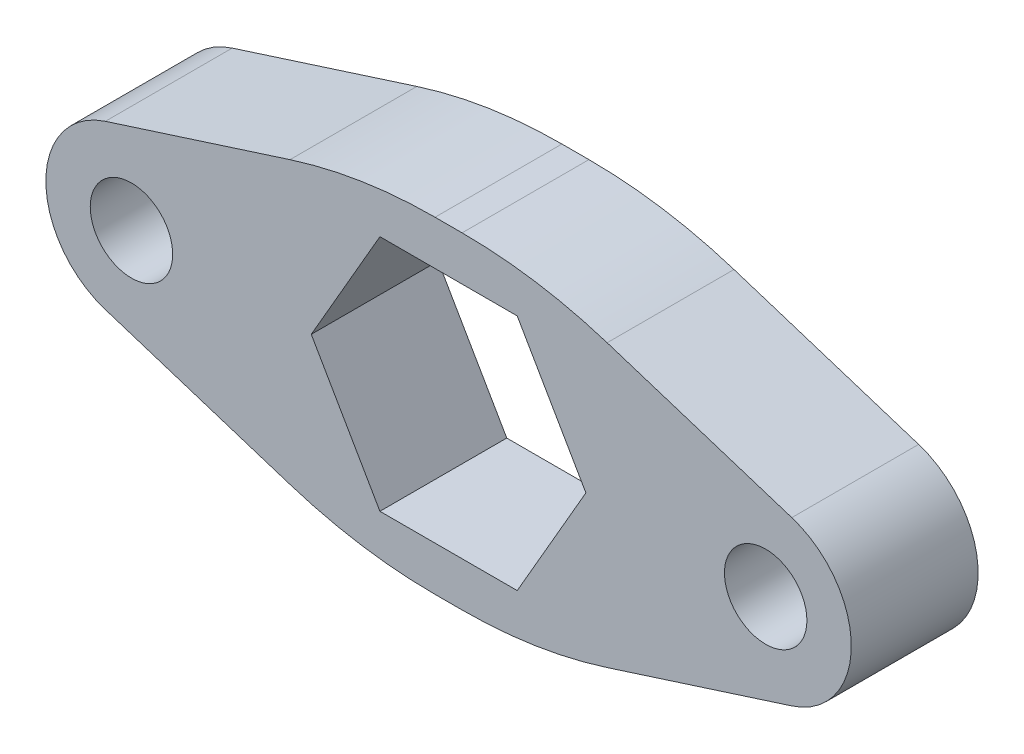
ISO-10303-21;
HEADER;
FILE_DESCRIPTION(('STEP AP214'),'2;1');
FILE_NAME('part.step','',(''),(''),'','','');
FILE_SCHEMA(('AUTOMOTIVE_DESIGN { 1 0 10303 214 1 1 1 1 }'));
ENDSEC;
DATA;
#1=APPLICATION_CONTEXT('core data for automotive mechanical design processes');
#2=APPLICATION_PROTOCOL_DEFINITION('international standard','automotive_design',2000,#1);
#3=PRODUCT_CONTEXT('',#1,'mechanical');
#4=PRODUCT('Part','Part','',(#3));
#5=PRODUCT_RELATED_PRODUCT_CATEGORY('part','',(#4));
#6=PRODUCT_DEFINITION_FORMATION('','',#4);
#7=PRODUCT_DEFINITION_CONTEXT('part definition',#1,'design');
#8=PRODUCT_DEFINITION('design','',#6,#7);
#9=PRODUCT_DEFINITION_SHAPE('','',#8);
#10=(LENGTH_UNIT() NAMED_UNIT(*) SI_UNIT(.MILLI.,.METRE.));
#11=(NAMED_UNIT(*) PLANE_ANGLE_UNIT() SI_UNIT($,.RADIAN.));
#12=(NAMED_UNIT(*) SI_UNIT($,.STERADIAN.) SOLID_ANGLE_UNIT());
#13=UNCERTAINTY_MEASURE_WITH_UNIT(LENGTH_MEASURE(1.E-05),#10,'distance_accuracy_value','');
#14=(GEOMETRIC_REPRESENTATION_CONTEXT(3) GLOBAL_UNCERTAINTY_ASSIGNED_CONTEXT((#13)) GLOBAL_UNIT_ASSIGNED_CONTEXT((#10,
#11,#12)) REPRESENTATION_CONTEXT('',''));
#15=CARTESIAN_POINT('',(0.,0.,0.));
#16=DIRECTION('',(0.,0.,1.));
#17=DIRECTION('',(1.,0.,0.));
#18=AXIS2_PLACEMENT_3D('',#15,#16,#17);
#19=CARTESIAN_POINT('',(-0.426426598898093,9.85,4.));
#20=DIRECTION('',(0.,0.,1.));
#21=DIRECTION('',(1.,0.,0.));
#22=AXIS2_PLACEMENT_3D('',#19,#20,#21);
#23=PLANE('',#22);
#24=CARTESIAN_POINT('',(-10.,0.,4.));
#25=DIRECTION('',(0.,0.,1.));
#26=DIRECTION('',(-1.,0.,0.));
#27=AXIS2_PLACEMENT_3D('',#24,#25,#26);
#28=CIRCLE('',#27,1.3);
#29=CARTESIAN_POINT('',(-11.3,0.,4.));
#30=VERTEX_POINT('',#29);
#31=EDGE_CURVE('E217',#30,#30,#28,.T.);
#32=ORIENTED_EDGE('',*,*,#31,.F.);
#33=EDGE_LOOP('',(#32));
#34=FACE_BOUND('',#33,.T.);
#35=CARTESIAN_POINT('',(-0.426426598898093,9.85,4.));
#36=DIRECTION('',(0.,0.,1.));
#37=DIRECTION('',(1.,0.,0.));
#38=AXIS2_PLACEMENT_3D('',#35,#36,#37);
#39=CIRCLE('',#38,15.);
#40=CARTESIAN_POINT('',(-5.,-4.4357420648958,4.));
#41=VERTEX_POINT('',#40);
#42=CARTESIAN_POINT('',(-0.426426598898093,-5.15,4.));
#43=VERTEX_POINT('',#42);
#44=EDGE_CURVE('E223',#41,#43,#39,.T.);
#45=ORIENTED_EDGE('',*,*,#44,.T.);
#46=DIRECTION('',(1.,0.,0.));
#47=VECTOR('',#46,1.);
#48=CARTESIAN_POINT('',(0.426426598898093,-5.15,4.));
#49=LINE('',#48,#47);
#50=CARTESIAN_POINT('',(0.426426598898093,-5.15,4.));
#51=VERTEX_POINT('',#50);
#52=EDGE_CURVE('E226',#43,#51,#49,.T.);
#53=ORIENTED_EDGE('',*,*,#52,.T.);
#54=CARTESIAN_POINT('',(0.426426598898093,9.85,4.));
#55=DIRECTION('',(0.,0.,1.));
#56=DIRECTION('',(-1.,0.,0.));
#57=AXIS2_PLACEMENT_3D('',#54,#55,#56);
#58=CIRCLE('',#57,15.);
#59=CARTESIAN_POINT('',(5.,-4.43574206489579,4.));
#60=VERTEX_POINT('',#59);
#61=EDGE_CURVE('E229',#51,#60,#58,.T.);
#62=ORIENTED_EDGE('',*,*,#61,.T.);
#63=DIRECTION('',(0.952382804326386,0.304904893406794,0.));
#64=VECTOR('',#63,1.);
#65=CARTESIAN_POINT('',(10.8232432121983,-2.57143357168124,4.));
#66=LINE('',#65,#64);
#67=CARTESIAN_POINT('',(10.8232432121983,-2.57143357168124,4.));
#68=VERTEX_POINT('',#67);
#69=EDGE_CURVE('E231',#60,#68,#66,.T.);
#70=ORIENTED_EDGE('',*,*,#69,.T.);
#71=CARTESIAN_POINT('',(10.,0.,4.));
#72=DIRECTION('',(0.,0.,1.));
#73=DIRECTION('',(1.,0.,0.));
#74=AXIS2_PLACEMENT_3D('',#71,#72,#73);
#75=CIRCLE('',#74,2.7);
#76=CARTESIAN_POINT('',(10.8232432121983,2.57143357168124,4.));
#77=VERTEX_POINT('',#76);
#78=EDGE_CURVE('E233',#68,#77,#75,.T.);
#79=ORIENTED_EDGE('',*,*,#78,.T.);
#80=DIRECTION('',(-0.952382804326386,0.304904893406794,0.));
#81=VECTOR('',#80,1.);
#82=CARTESIAN_POINT('',(10.8232432121983,2.57143357168124,4.));
#83=LINE('',#82,#81);
#84=CARTESIAN_POINT('',(5.,4.4357420648958,4.));
#85=VERTEX_POINT('',#84);
#86=EDGE_CURVE('E235',#77,#85,#83,.T.);
#87=ORIENTED_EDGE('',*,*,#86,.T.);
#88=CARTESIAN_POINT('',(0.426426598898093,-9.85,4.));
#89=DIRECTION('',(0.,0.,1.));
#90=DIRECTION('',(1.,0.,0.));
#91=AXIS2_PLACEMENT_3D('',#88,#89,#90);
#92=CIRCLE('',#91,15.);
#93=CARTESIAN_POINT('',(0.426426598898094,5.15,4.));
#94=VERTEX_POINT('',#93);
#95=EDGE_CURVE('E237',#85,#94,#92,.T.);
#96=ORIENTED_EDGE('',*,*,#95,.T.);
#97=DIRECTION('',(-1.,0.,0.));
#98=VECTOR('',#97,1.);
#99=CARTESIAN_POINT('',(0.426426598898093,5.15,4.));
#100=LINE('',#99,#98);
#101=CARTESIAN_POINT('',(-0.426426598898093,5.15,4.));
#102=VERTEX_POINT('',#101);
#103=EDGE_CURVE('E239',#94,#102,#100,.T.);
#104=ORIENTED_EDGE('',*,*,#103,.T.);
#105=CARTESIAN_POINT('',(-0.426426598898093,-9.85,4.));
#106=DIRECTION('',(0.,0.,1.));
#107=DIRECTION('',(-1.,0.,0.));
#108=AXIS2_PLACEMENT_3D('',#105,#106,#107);
#109=CIRCLE('',#108,15.);
#110=CARTESIAN_POINT('',(-5.,4.4357420648958,4.));
#111=VERTEX_POINT('',#110);
#112=EDGE_CURVE('E241',#102,#111,#109,.T.);
#113=ORIENTED_EDGE('',*,*,#112,.T.);
#114=DIRECTION('',(-0.952382804326386,-0.304904893406794,0.));
#115=VECTOR('',#114,1.);
#116=CARTESIAN_POINT('',(-10.8232432121983,2.57143357168124,4.));
#117=LINE('',#116,#115);
#118=CARTESIAN_POINT('',(-10.8232432121983,2.57143357168124,4.));
#119=VERTEX_POINT('',#118);
#120=EDGE_CURVE('E243',#111,#119,#117,.T.);
#121=ORIENTED_EDGE('',*,*,#120,.T.);
#122=CARTESIAN_POINT('',(-10.,0.,4.));
#123=DIRECTION('',(0.,0.,1.));
#124=DIRECTION('',(-1.,0.,0.));
#125=AXIS2_PLACEMENT_3D('',#122,#123,#124);
#126=CIRCLE('',#125,2.7);
#127=CARTESIAN_POINT('',(-10.8232432121983,-2.57143357168125,4.));
#128=VERTEX_POINT('',#127);
#129=EDGE_CURVE('E245',#119,#128,#126,.T.);
#130=ORIENTED_EDGE('',*,*,#129,.T.);
#131=DIRECTION('',(0.952382804326386,-0.304904893406794,0.));
#132=VECTOR('',#131,1.);
#133=CARTESIAN_POINT('',(-10.8232432121983,-2.57143357168124,4.));
#134=LINE('',#133,#132);
#135=EDGE_CURVE('E247',#128,#41,#134,.T.);
#136=ORIENTED_EDGE('',*,*,#135,.T.);
#137=EDGE_LOOP('',(#45,#53,#62,#70,#79,#87,#96,#104,#113,#121,#130,#136));
#138=FACE_BOUND('',#137,.T.);
#139=CARTESIAN_POINT('',(10.,0.,4.));
#140=DIRECTION('',(0.,0.,1.));
#141=DIRECTION('',(1.,0.,0.));
#142=AXIS2_PLACEMENT_3D('',#139,#140,#141);
#143=CIRCLE('',#142,1.3);
#144=CARTESIAN_POINT('',(11.3,0.,4.));
#145=VERTEX_POINT('',#144);
#146=EDGE_CURVE('E211',#145,#145,#143,.T.);
#147=ORIENTED_EDGE('',*,*,#146,.F.);
#148=EDGE_LOOP('',(#147));
#149=FACE_BOUND('',#148,.T.);
#150=DIRECTION('',(-1.,0.,0.));
#151=VECTOR('',#150,1.);
#152=CARTESIAN_POINT('',(2.1650635094611,3.75,4.));
#153=LINE('',#152,#151);
#154=CARTESIAN_POINT('',(2.1650635094611,3.75,4.));
#155=VERTEX_POINT('',#154);
#156=CARTESIAN_POINT('',(-2.1650635094611,3.75,4.));
#157=VERTEX_POINT('',#156);
#158=EDGE_CURVE('E168',#155,#157,#153,.T.);
#159=ORIENTED_EDGE('',*,*,#158,.F.);
#160=DIRECTION('',(-0.5,0.866025403784439,0.));
#161=VECTOR('',#160,1.);
#162=CARTESIAN_POINT('',(4.33012701892219,0.,4.));
#163=LINE('',#162,#161);
#164=CARTESIAN_POINT('',(4.33012701892219,0.,4.));
#165=VERTEX_POINT('',#164);
#166=EDGE_CURVE('E160',#165,#155,#163,.T.);
#167=ORIENTED_EDGE('',*,*,#166,.F.);
#168=DIRECTION('',(0.5,0.866025403784439,0.));
#169=VECTOR('',#168,1.);
#170=CARTESIAN_POINT('',(2.1650635094611,-3.75,4.));
#171=LINE('',#170,#169);
#172=CARTESIAN_POINT('',(2.1650635094611,-3.75,4.));
#173=VERTEX_POINT('',#172);
#174=EDGE_CURVE('E189',#173,#165,#171,.T.);
#175=ORIENTED_EDGE('',*,*,#174,.F.);
#176=DIRECTION('',(1.,0.,0.));
#177=VECTOR('',#176,1.);
#178=CARTESIAN_POINT('',(-2.1650635094611,-3.75,4.));
#179=LINE('',#178,#177);
#180=CARTESIAN_POINT('',(-2.1650635094611,-3.75,4.));
#181=VERTEX_POINT('',#180);
#182=EDGE_CURVE('E187',#181,#173,#179,.T.);
#183=ORIENTED_EDGE('',*,*,#182,.F.);
#184=DIRECTION('',(0.5,-0.866025403784439,0.));
#185=VECTOR('',#184,1.);
#186=CARTESIAN_POINT('',(-4.33012701892219,0.,4.));
#187=LINE('',#186,#185);
#188=CARTESIAN_POINT('',(-4.33012701892219,0.,4.));
#189=VERTEX_POINT('',#188);
#190=EDGE_CURVE('E183',#189,#181,#187,.T.);
#191=ORIENTED_EDGE('',*,*,#190,.F.);
#192=DIRECTION('',(-0.5,-0.866025403784439,0.));
#193=VECTOR('',#192,1.);
#194=CARTESIAN_POINT('',(-2.1650635094611,3.75,4.));
#195=LINE('',#194,#193);
#196=EDGE_CURVE('E181',#157,#189,#195,.T.);
#197=ORIENTED_EDGE('',*,*,#196,.F.);
#198=EDGE_LOOP('',(#159,#167,#175,#183,#191,#197));
#199=FACE_BOUND('',#198,.T.);
#200=ADVANCED_FACE('F35',(#34,#138,#149,#199),#23,.T.);
#201=CARTESIAN_POINT('',(-0.426426598898093,9.85,0.));
#202=DIRECTION('',(0.,0.,1.));
#203=DIRECTION('',(1.,0.,0.));
#204=AXIS2_PLACEMENT_3D('',#201,#202,#203);
#205=PLANE('',#204);
#206=CARTESIAN_POINT('',(10.,0.,0.));
#207=DIRECTION('',(0.,0.,1.));
#208=DIRECTION('',(1.,0.,0.));
#209=AXIS2_PLACEMENT_3D('',#206,#207,#208);
#210=CIRCLE('',#209,1.3);
#211=CARTESIAN_POINT('',(11.3,0.,0.));
#212=VERTEX_POINT('',#211);
#213=EDGE_CURVE('E176',#212,#212,#210,.T.);
#214=ORIENTED_EDGE('',*,*,#213,.T.);
#215=EDGE_LOOP('',(#214));
#216=FACE_BOUND('',#215,.T.);
#217=CARTESIAN_POINT('',(-10.,0.,0.));
#218=DIRECTION('',(0.,0.,1.));
#219=DIRECTION('',(-1.,0.,0.));
#220=AXIS2_PLACEMENT_3D('',#217,#218,#219);
#221=CIRCLE('',#220,1.3);
#222=CARTESIAN_POINT('',(-11.3,0.,0.));
#223=VERTEX_POINT('',#222);
#224=EDGE_CURVE('E214',#223,#223,#221,.T.);
#225=ORIENTED_EDGE('',*,*,#224,.T.);
#226=EDGE_LOOP('',(#225));
#227=FACE_BOUND('',#226,.T.);
#228=CARTESIAN_POINT('',(-0.426426598898093,9.85,0.));
#229=DIRECTION('',(0.,0.,1.));
#230=DIRECTION('',(1.,0.,0.));
#231=AXIS2_PLACEMENT_3D('',#228,#229,#230);
#232=CIRCLE('',#231,15.);
#233=CARTESIAN_POINT('',(-5.,-4.4357420648958,0.));
#234=VERTEX_POINT('',#233);
#235=CARTESIAN_POINT('',(-0.426426598898093,-5.15,0.));
#236=VERTEX_POINT('',#235);
#237=EDGE_CURVE('E220',#234,#236,#232,.T.);
#238=ORIENTED_EDGE('',*,*,#237,.F.);
#239=DIRECTION('',(0.952382804326386,-0.304904893406794,0.));
#240=VECTOR('',#239,1.);
#241=CARTESIAN_POINT('',(-10.8232432121983,-2.57143357168124,0.));
#242=LINE('',#241,#240);
#243=CARTESIAN_POINT('',(-10.8232432121983,-2.57143357168125,0.));
#244=VERTEX_POINT('',#243);
#245=EDGE_CURVE('E227',#244,#234,#242,.T.);
#246=ORIENTED_EDGE('',*,*,#245,.F.);
#247=CARTESIAN_POINT('',(-10.,0.,0.));
#248=DIRECTION('',(0.,0.,1.));
#249=DIRECTION('',(-1.,0.,0.));
#250=AXIS2_PLACEMENT_3D('',#247,#248,#249);
#251=CIRCLE('',#250,2.7);
#252=CARTESIAN_POINT('',(-10.8232432121983,2.57143357168124,0.));
#253=VERTEX_POINT('',#252);
#254=EDGE_CURVE('E270',#253,#244,#251,.T.);
#255=ORIENTED_EDGE('',*,*,#254,.F.);
#256=DIRECTION('',(-0.952382804326386,-0.304904893406794,0.));
#257=VECTOR('',#256,1.);
#258=CARTESIAN_POINT('',(-10.8232432121983,2.57143357168124,0.));
#259=LINE('',#258,#257);
#260=CARTESIAN_POINT('',(-5.,4.4357420648958,0.));
#261=VERTEX_POINT('',#260);
#262=EDGE_CURVE('E268',#261,#253,#259,.T.);
#263=ORIENTED_EDGE('',*,*,#262,.F.);
#264=CARTESIAN_POINT('',(-0.426426598898093,-9.85,0.));
#265=DIRECTION('',(0.,0.,1.));
#266=DIRECTION('',(-1.,0.,0.));
#267=AXIS2_PLACEMENT_3D('',#264,#265,#266);
#268=CIRCLE('',#267,15.);
#269=CARTESIAN_POINT('',(-0.426426598898093,5.15,0.));
#270=VERTEX_POINT('',#269);
#271=EDGE_CURVE('E266',#270,#261,#268,.T.);
#272=ORIENTED_EDGE('',*,*,#271,.F.);
#273=DIRECTION('',(-1.,0.,0.));
#274=VECTOR('',#273,1.);
#275=CARTESIAN_POINT('',(0.426426598898093,5.15,0.));
#276=LINE('',#275,#274);
#277=CARTESIAN_POINT('',(0.426426598898094,5.15,0.));
#278=VERTEX_POINT('',#277);
#279=EDGE_CURVE('E264',#278,#270,#276,.T.);
#280=ORIENTED_EDGE('',*,*,#279,.F.);
#281=CARTESIAN_POINT('',(0.426426598898093,-9.85,0.));
#282=DIRECTION('',(0.,0.,1.));
#283=DIRECTION('',(1.,0.,0.));
#284=AXIS2_PLACEMENT_3D('',#281,#282,#283);
#285=CIRCLE('',#284,15.);
#286=CARTESIAN_POINT('',(5.,4.4357420648958,0.));
#287=VERTEX_POINT('',#286);
#288=EDGE_CURVE('E262',#287,#278,#285,.T.);
#289=ORIENTED_EDGE('',*,*,#288,.F.);
#290=DIRECTION('',(-0.952382804326386,0.304904893406794,0.));
#291=VECTOR('',#290,1.);
#292=CARTESIAN_POINT('',(10.8232432121983,2.57143357168124,0.));
#293=LINE('',#292,#291);
#294=CARTESIAN_POINT('',(10.8232432121983,2.57143357168124,0.));
#295=VERTEX_POINT('',#294);
#296=EDGE_CURVE('E260',#295,#287,#293,.T.);
#297=ORIENTED_EDGE('',*,*,#296,.F.);
#298=CARTESIAN_POINT('',(10.,0.,0.));
#299=DIRECTION('',(0.,0.,1.));
#300=DIRECTION('',(1.,0.,0.));
#301=AXIS2_PLACEMENT_3D('',#298,#299,#300);
#302=CIRCLE('',#301,2.7);
#303=CARTESIAN_POINT('',(10.8232432121983,-2.57143357168124,0.));
#304=VERTEX_POINT('',#303);
#305=EDGE_CURVE('E258',#304,#295,#302,.T.);
#306=ORIENTED_EDGE('',*,*,#305,.F.);
#307=DIRECTION('',(0.952382804326386,0.304904893406794,0.));
#308=VECTOR('',#307,1.);
#309=CARTESIAN_POINT('',(10.8232432121983,-2.57143357168124,0.));
#310=LINE('',#309,#308);
#311=CARTESIAN_POINT('',(5.,-4.43574206489579,0.));
#312=VERTEX_POINT('',#311);
#313=EDGE_CURVE('E256',#312,#304,#310,.T.);
#314=ORIENTED_EDGE('',*,*,#313,.F.);
#315=CARTESIAN_POINT('',(0.426426598898093,9.85,0.));
#316=DIRECTION('',(0.,0.,1.));
#317=DIRECTION('',(-1.,0.,0.));
#318=AXIS2_PLACEMENT_3D('',#315,#316,#317);
#319=CIRCLE('',#318,15.);
#320=CARTESIAN_POINT('',(0.426426598898093,-5.15,0.));
#321=VERTEX_POINT('',#320);
#322=EDGE_CURVE('E254',#321,#312,#319,.T.);
#323=ORIENTED_EDGE('',*,*,#322,.F.);
#324=DIRECTION('',(1.,0.,0.));
#325=VECTOR('',#324,1.);
#326=CARTESIAN_POINT('',(0.426426598898093,-5.15,0.));
#327=LINE('',#326,#325);
#328=EDGE_CURVE('E252',#236,#321,#327,.T.);
#329=ORIENTED_EDGE('',*,*,#328,.F.);
#330=EDGE_LOOP('',(#238,#246,#255,#263,#272,#280,#289,#297,#306,#314,#323,#329));
#331=FACE_BOUND('',#330,.T.);
#332=DIRECTION('',(-0.5,0.866025403784439,0.));
#333=VECTOR('',#332,1.);
#334=CARTESIAN_POINT('',(4.33012701892219,0.,0.));
#335=LINE('',#334,#333);
#336=CARTESIAN_POINT('',(4.33012701892219,0.,0.));
#337=VERTEX_POINT('',#336);
#338=CARTESIAN_POINT('',(2.1650635094611,3.75,0.));
#339=VERTEX_POINT('',#338);
#340=EDGE_CURVE('E58',#337,#339,#335,.T.);
#341=ORIENTED_EDGE('',*,*,#340,.T.);
#342=DIRECTION('',(-1.,0.,0.));
#343=VECTOR('',#342,1.);
#344=CARTESIAN_POINT('',(2.1650635094611,3.75,0.));
#345=LINE('',#344,#343);
#346=CARTESIAN_POINT('',(-2.1650635094611,3.75,0.));
#347=VERTEX_POINT('',#346);
#348=EDGE_CURVE('E175',#339,#347,#345,.T.);
#349=ORIENTED_EDGE('',*,*,#348,.T.);
#350=DIRECTION('',(-0.5,-0.866025403784439,0.));
#351=VECTOR('',#350,1.);
#352=CARTESIAN_POINT('',(-2.1650635094611,3.75,0.));
#353=LINE('',#352,#351);
#354=CARTESIAN_POINT('',(-4.33012701892219,0.,0.));
#355=VERTEX_POINT('',#354);
#356=EDGE_CURVE('E193',#347,#355,#353,.T.);
#357=ORIENTED_EDGE('',*,*,#356,.T.);
#358=DIRECTION('',(0.5,-0.866025403784439,0.));
#359=VECTOR('',#358,1.);
#360=CARTESIAN_POINT('',(-4.33012701892219,0.,0.));
#361=LINE('',#360,#359);
#362=CARTESIAN_POINT('',(-2.1650635094611,-3.75,0.));
#363=VERTEX_POINT('',#362);
#364=EDGE_CURVE('E196',#355,#363,#361,.T.);
#365=ORIENTED_EDGE('',*,*,#364,.T.);
#366=DIRECTION('',(1.,0.,0.));
#367=VECTOR('',#366,1.);
#368=CARTESIAN_POINT('',(-2.1650635094611,-3.75,0.));
#369=LINE('',#368,#367);
#370=CARTESIAN_POINT('',(2.1650635094611,-3.75,0.));
#371=VERTEX_POINT('',#370);
#372=EDGE_CURVE('E199',#363,#371,#369,.T.);
#373=ORIENTED_EDGE('',*,*,#372,.T.);
#374=DIRECTION('',(0.5,0.866025403784439,0.));
#375=VECTOR('',#374,1.);
#376=CARTESIAN_POINT('',(2.1650635094611,-3.75,0.));
#377=LINE('',#376,#375);
#378=EDGE_CURVE('E169',#371,#337,#377,.T.);
#379=ORIENTED_EDGE('',*,*,#378,.T.);
#380=EDGE_LOOP('',(#341,#349,#357,#365,#373,#379));
#381=FACE_BOUND('',#380,.T.);
#382=ADVANCED_FACE('F312',(#216,#227,#331,#381),#205,.F.);
#383=CARTESIAN_POINT('',(-0.426426598898093,9.85,4.));
#384=DIRECTION('',(0.,0.,-1.));
#385=DIRECTION('',(-1.,0.,0.));
#386=AXIS2_PLACEMENT_3D('',#383,#384,#385);
#387=CYLINDRICAL_SURFACE('',#386,15.);
#388=ORIENTED_EDGE('',*,*,#237,.T.);
#389=DIRECTION('',(0.,0.,-1.));
#390=VECTOR('',#389,1.);
#391=CARTESIAN_POINT('',(-0.426426598898093,-5.15,4.));
#392=LINE('',#391,#390);
#393=EDGE_CURVE('E11',#43,#236,#392,.T.);
#394=ORIENTED_EDGE('',*,*,#393,.F.);
#395=ORIENTED_EDGE('',*,*,#44,.F.);
#396=DIRECTION('',(0.,0.,-1.));
#397=VECTOR('',#396,1.);
#398=CARTESIAN_POINT('',(-5.,-4.4357420648958,4.));
#399=LINE('',#398,#397);
#400=EDGE_CURVE('E249',#41,#234,#399,.T.);
#401=ORIENTED_EDGE('',*,*,#400,.T.);
#402=EDGE_LOOP('',(#388,#394,#395,#401));
#403=FACE_BOUND('',#402,.T.);
#404=ADVANCED_FACE('F37',(#403),#387,.T.);
#405=CARTESIAN_POINT('',(0.426426598898093,-5.15,4.));
#406=DIRECTION('',(0.,1.,0.));
#407=DIRECTION('',(0.,0.,1.));
#408=AXIS2_PLACEMENT_3D('',#405,#406,#407);
#409=PLANE('',#408);
#410=ORIENTED_EDGE('',*,*,#328,.T.);
#411=DIRECTION('',(0.,0.,-1.));
#412=VECTOR('',#411,1.);
#413=CARTESIAN_POINT('',(0.426426598898093,-5.15,4.));
#414=LINE('',#413,#412);
#415=EDGE_CURVE('E43',#51,#321,#414,.T.);
#416=ORIENTED_EDGE('',*,*,#415,.F.);
#417=ORIENTED_EDGE('',*,*,#52,.F.);
#418=ORIENTED_EDGE('',*,*,#393,.T.);
#419=EDGE_LOOP('',(#410,#416,#417,#418));
#420=FACE_BOUND('',#419,.T.);
#421=ADVANCED_FACE('F330',(#420),#409,.F.);
#422=CARTESIAN_POINT('',(0.426426598898093,9.85,4.));
#423=DIRECTION('',(0.,0.,-1.));
#424=DIRECTION('',(-1.,0.,0.));
#425=AXIS2_PLACEMENT_3D('',#422,#423,#424);
#426=CYLINDRICAL_SURFACE('',#425,15.);
#427=ORIENTED_EDGE('',*,*,#322,.T.);
#428=DIRECTION('',(0.,0.,-1.));
#429=VECTOR('',#428,1.);
#430=CARTESIAN_POINT('',(5.,-4.43574206489579,4.));
#431=LINE('',#430,#429);
#432=EDGE_CURVE('E299',#60,#312,#431,.T.);
#433=ORIENTED_EDGE('',*,*,#432,.F.);
#434=ORIENTED_EDGE('',*,*,#61,.F.);
#435=ORIENTED_EDGE('',*,*,#415,.T.);
#436=EDGE_LOOP('',(#427,#433,#434,#435));
#437=FACE_BOUND('',#436,.T.);
#438=ADVANCED_FACE('F306',(#437),#426,.T.);
#439=CARTESIAN_POINT('',(10.8232432121983,-2.57143357168124,4.));
#440=DIRECTION('',(-0.304904893406795,0.952382804326386,0.));
#441=DIRECTION('',(-0.952382804326386,-0.304904893406795,0.));
#442=AXIS2_PLACEMENT_3D('',#439,#440,#441);
#443=PLANE('',#442);
#444=ORIENTED_EDGE('',*,*,#313,.T.);
#445=DIRECTION('',(0.,0.,-1.));
#446=VECTOR('',#445,1.);
#447=CARTESIAN_POINT('',(10.8232432121983,-2.57143357168124,4.));
#448=LINE('',#447,#446);
#449=EDGE_CURVE('E296',#68,#304,#448,.T.);
#450=ORIENTED_EDGE('',*,*,#449,.F.);
#451=ORIENTED_EDGE('',*,*,#69,.F.);
#452=ORIENTED_EDGE('',*,*,#432,.T.);
#453=EDGE_LOOP('',(#444,#450,#451,#452));
#454=FACE_BOUND('',#453,.T.);
#455=ADVANCED_FACE('F318',(#454),#443,.F.);
#456=CARTESIAN_POINT('',(10.,0.,4.));
#457=DIRECTION('',(0.,0.,-1.));
#458=DIRECTION('',(-1.,0.,0.));
#459=AXIS2_PLACEMENT_3D('',#456,#457,#458);
#460=CYLINDRICAL_SURFACE('',#459,2.7);
#461=ORIENTED_EDGE('',*,*,#305,.T.);
#462=DIRECTION('',(0.,0.,-1.));
#463=VECTOR('',#462,1.);
#464=CARTESIAN_POINT('',(10.8232432121983,2.57143357168124,4.));
#465=LINE('',#464,#463);
#466=EDGE_CURVE('E293',#77,#295,#465,.T.);
#467=ORIENTED_EDGE('',*,*,#466,.F.);
#468=ORIENTED_EDGE('',*,*,#78,.F.);
#469=ORIENTED_EDGE('',*,*,#449,.T.);
#470=EDGE_LOOP('',(#461,#467,#468,#469));
#471=FACE_BOUND('',#470,.T.);
#472=ADVANCED_FACE('F322',(#471),#460,.T.);
#473=CARTESIAN_POINT('',(10.8232432121983,2.57143357168124,4.));
#474=DIRECTION('',(-0.304904893406795,-0.952382804326386,0.));
#475=DIRECTION('',(0.952382804326386,-0.304904893406795,0.));
#476=AXIS2_PLACEMENT_3D('',#473,#474,#475);
#477=PLANE('',#476);
#478=ORIENTED_EDGE('',*,*,#296,.T.);
#479=DIRECTION('',(0.,0.,-1.));
#480=VECTOR('',#479,1.);
#481=CARTESIAN_POINT('',(5.,4.4357420648958,4.));
#482=LINE('',#481,#480);
#483=EDGE_CURVE('E290',#85,#287,#482,.T.);
#484=ORIENTED_EDGE('',*,*,#483,.F.);
#485=ORIENTED_EDGE('',*,*,#86,.F.);
#486=ORIENTED_EDGE('',*,*,#466,.T.);
#487=EDGE_LOOP('',(#478,#484,#485,#486));
#488=FACE_BOUND('',#487,.T.);
#489=ADVANCED_FACE('F363',(#488),#477,.F.);
#490=CARTESIAN_POINT('',(0.426426598898093,-9.85,4.));
#491=DIRECTION('',(0.,0.,-1.));
#492=DIRECTION('',(-1.,0.,0.));
#493=AXIS2_PLACEMENT_3D('',#490,#491,#492);
#494=CYLINDRICAL_SURFACE('',#493,15.);
#495=ORIENTED_EDGE('',*,*,#288,.T.);
#496=DIRECTION('',(0.,0.,-1.));
#497=VECTOR('',#496,1.);
#498=CARTESIAN_POINT('',(0.426426598898094,5.15,4.));
#499=LINE('',#498,#497);
#500=EDGE_CURVE('E287',#94,#278,#499,.T.);
#501=ORIENTED_EDGE('',*,*,#500,.F.);
#502=ORIENTED_EDGE('',*,*,#95,.F.);
#503=ORIENTED_EDGE('',*,*,#483,.T.);
#504=EDGE_LOOP('',(#495,#501,#502,#503));
#505=FACE_BOUND('',#504,.T.);
#506=ADVANCED_FACE('F361',(#505),#494,.T.);
#507=CARTESIAN_POINT('',(0.426426598898093,5.15,4.));
#508=DIRECTION('',(0.,-1.,0.));
#509=DIRECTION('',(0.,0.,-1.));
#510=AXIS2_PLACEMENT_3D('',#507,#508,#509);
#511=PLANE('',#510);
#512=ORIENTED_EDGE('',*,*,#279,.T.);
#513=DIRECTION('',(0.,0.,-1.));
#514=VECTOR('',#513,1.);
#515=CARTESIAN_POINT('',(-0.426426598898093,5.15,4.));
#516=LINE('',#515,#514);
#517=EDGE_CURVE('E284',#102,#270,#516,.T.);
#518=ORIENTED_EDGE('',*,*,#517,.F.);
#519=ORIENTED_EDGE('',*,*,#103,.F.);
#520=ORIENTED_EDGE('',*,*,#500,.T.);
#521=EDGE_LOOP('',(#512,#518,#519,#520));
#522=FACE_BOUND('',#521,.T.);
#523=ADVANCED_FACE('F357',(#522),#511,.F.);
#524=CARTESIAN_POINT('',(-0.426426598898093,-9.85,4.));
#525=DIRECTION('',(0.,0.,-1.));
#526=DIRECTION('',(-1.,0.,0.));
#527=AXIS2_PLACEMENT_3D('',#524,#525,#526);
#528=CYLINDRICAL_SURFACE('',#527,15.);
#529=ORIENTED_EDGE('',*,*,#271,.T.);
#530=DIRECTION('',(0.,0.,-1.));
#531=VECTOR('',#530,1.);
#532=CARTESIAN_POINT('',(-5.,4.4357420648958,4.));
#533=LINE('',#532,#531);
#534=EDGE_CURVE('E281',#111,#261,#533,.T.);
#535=ORIENTED_EDGE('',*,*,#534,.F.);
#536=ORIENTED_EDGE('',*,*,#112,.F.);
#537=ORIENTED_EDGE('',*,*,#517,.T.);
#538=EDGE_LOOP('',(#529,#535,#536,#537));
#539=FACE_BOUND('',#538,.T.);
#540=ADVANCED_FACE('F352',(#539),#528,.T.);
#541=CARTESIAN_POINT('',(-10.8232432121983,2.57143357168124,4.));
#542=DIRECTION('',(0.304904893406795,-0.952382804326386,0.));
#543=DIRECTION('',(0.952382804326386,0.304904893406795,0.));
#544=AXIS2_PLACEMENT_3D('',#541,#542,#543);
#545=PLANE('',#544);
#546=ORIENTED_EDGE('',*,*,#262,.T.);
#547=DIRECTION('',(0.,0.,-1.));
#548=VECTOR('',#547,1.);
#549=CARTESIAN_POINT('',(-10.8232432121983,2.57143357168124,4.));
#550=LINE('',#549,#548);
#551=EDGE_CURVE('E278',#119,#253,#550,.T.);
#552=ORIENTED_EDGE('',*,*,#551,.F.);
#553=ORIENTED_EDGE('',*,*,#120,.F.);
#554=ORIENTED_EDGE('',*,*,#534,.T.);
#555=EDGE_LOOP('',(#546,#552,#553,#554));
#556=FACE_BOUND('',#555,.T.);
#557=ADVANCED_FACE('F346',(#556),#545,.F.);
#558=CARTESIAN_POINT('',(-10.,0.,4.));
#559=DIRECTION('',(0.,0.,-1.));
#560=DIRECTION('',(-1.,0.,0.));
#561=AXIS2_PLACEMENT_3D('',#558,#559,#560);
#562=CYLINDRICAL_SURFACE('',#561,2.7);
#563=ORIENTED_EDGE('',*,*,#254,.T.);
#564=DIRECTION('',(0.,0.,-1.));
#565=VECTOR('',#564,1.);
#566=CARTESIAN_POINT('',(-10.8232432121983,-2.57143357168125,4.));
#567=LINE('',#566,#565);
#568=EDGE_CURVE('E275',#128,#244,#567,.T.);
#569=ORIENTED_EDGE('',*,*,#568,.F.);
#570=ORIENTED_EDGE('',*,*,#129,.F.);
#571=ORIENTED_EDGE('',*,*,#551,.T.);
#572=EDGE_LOOP('',(#563,#569,#570,#571));
#573=FACE_BOUND('',#572,.T.);
#574=ADVANCED_FACE('F342',(#573),#562,.T.);
#575=CARTESIAN_POINT('',(-10.8232432121983,-2.57143357168124,4.));
#576=DIRECTION('',(0.304904893406795,0.952382804326386,0.));
#577=DIRECTION('',(-0.952382804326386,0.304904893406795,0.));
#578=AXIS2_PLACEMENT_3D('',#575,#576,#577);
#579=PLANE('',#578);
#580=ORIENTED_EDGE('',*,*,#245,.T.);
#581=ORIENTED_EDGE('',*,*,#400,.F.);
#582=ORIENTED_EDGE('',*,*,#135,.F.);
#583=ORIENTED_EDGE('',*,*,#568,.T.);
#584=EDGE_LOOP('',(#580,#581,#582,#583));
#585=FACE_BOUND('',#584,.T.);
#586=ADVANCED_FACE('F337',(#585),#579,.F.);
#587=CARTESIAN_POINT('',(-10.,0.,4.));
#588=DIRECTION('',(0.,0.,-1.));
#589=DIRECTION('',(-1.,0.,0.));
#590=AXIS2_PLACEMENT_3D('',#587,#588,#589);
#591=CYLINDRICAL_SURFACE('',#590,1.3);
#592=ORIENTED_EDGE('',*,*,#31,.T.);
#593=EDGE_LOOP('',(#592));
#594=FACE_BOUND('',#593,.T.);
#595=ORIENTED_EDGE('',*,*,#224,.F.);
#596=EDGE_LOOP('',(#595));
#597=FACE_BOUND('',#596,.T.);
#598=ADVANCED_FACE('F382',(#594,#597),#591,.F.);
#599=CARTESIAN_POINT('',(10.,0.,4.));
#600=DIRECTION('',(0.,0.,-1.));
#601=DIRECTION('',(-1.,0.,0.));
#602=AXIS2_PLACEMENT_3D('',#599,#600,#601);
#603=CYLINDRICAL_SURFACE('',#602,1.3);
#604=ORIENTED_EDGE('',*,*,#146,.T.);
#605=EDGE_LOOP('',(#604));
#606=FACE_BOUND('',#605,.T.);
#607=ORIENTED_EDGE('',*,*,#213,.F.);
#608=EDGE_LOOP('',(#607));
#609=FACE_BOUND('',#608,.T.);
#610=ADVANCED_FACE('F420',(#606,#609),#603,.F.);
#611=CARTESIAN_POINT('',(4.33012701892219,0.,4.));
#612=DIRECTION('',(-0.866025403784439,-0.5,0.));
#613=DIRECTION('',(0.5,-0.866025403784439,0.));
#614=AXIS2_PLACEMENT_3D('',#611,#612,#613);
#615=PLANE('',#614);
#616=ORIENTED_EDGE('',*,*,#340,.F.);
#617=DIRECTION('',(0.,0.,-1.));
#618=VECTOR('',#617,1.);
#619=CARTESIAN_POINT('',(4.33012701892219,0.,4.));
#620=LINE('',#619,#618);
#621=EDGE_CURVE('E164',#165,#337,#620,.T.);
#622=ORIENTED_EDGE('',*,*,#621,.F.);
#623=ORIENTED_EDGE('',*,*,#166,.T.);
#624=DIRECTION('',(0.,0.,-1.));
#625=VECTOR('',#624,1.);
#626=CARTESIAN_POINT('',(2.1650635094611,3.75,4.));
#627=LINE('',#626,#625);
#628=EDGE_CURVE('E163',#155,#339,#627,.T.);
#629=ORIENTED_EDGE('',*,*,#628,.T.);
#630=EDGE_LOOP('',(#616,#622,#623,#629));
#631=FACE_BOUND('',#630,.T.);
#632=ADVANCED_FACE('F162',(#631),#615,.T.);
#633=CARTESIAN_POINT('',(2.1650635094611,3.75,4.));
#634=DIRECTION('',(0.,-1.,0.));
#635=DIRECTION('',(0.,0.,-1.));
#636=AXIS2_PLACEMENT_3D('',#633,#634,#635);
#637=PLANE('',#636);
#638=ORIENTED_EDGE('',*,*,#348,.F.);
#639=ORIENTED_EDGE('',*,*,#628,.F.);
#640=ORIENTED_EDGE('',*,*,#158,.T.);
#641=DIRECTION('',(0.,0.,-1.));
#642=VECTOR('',#641,1.);
#643=CARTESIAN_POINT('',(-2.1650635094611,3.75,4.));
#644=LINE('',#643,#642);
#645=EDGE_CURVE('E177',#157,#347,#644,.T.);
#646=ORIENTED_EDGE('',*,*,#645,.T.);
#647=EDGE_LOOP('',(#638,#639,#640,#646));
#648=FACE_BOUND('',#647,.T.);
#649=ADVANCED_FACE('F172',(#648),#637,.T.);
#650=CARTESIAN_POINT('',(-2.1650635094611,3.75,4.));
#651=DIRECTION('',(0.866025403784439,-0.5,0.));
#652=DIRECTION('',(0.5,0.866025403784439,0.));
#653=AXIS2_PLACEMENT_3D('',#650,#651,#652);
#654=PLANE('',#653);
#655=ORIENTED_EDGE('',*,*,#356,.F.);
#656=ORIENTED_EDGE('',*,*,#645,.F.);
#657=ORIENTED_EDGE('',*,*,#196,.T.);
#658=DIRECTION('',(0.,0.,-1.));
#659=VECTOR('',#658,1.);
#660=CARTESIAN_POINT('',(-4.33012701892219,0.,4.));
#661=LINE('',#660,#659);
#662=EDGE_CURVE('E208',#189,#355,#661,.T.);
#663=ORIENTED_EDGE('',*,*,#662,.T.);
#664=EDGE_LOOP('',(#655,#656,#657,#663));
#665=FACE_BOUND('',#664,.T.);
#666=ADVANCED_FACE('F439',(#665),#654,.T.);
#667=CARTESIAN_POINT('',(-4.33012701892219,0.,4.));
#668=DIRECTION('',(0.866025403784439,0.5,0.));
#669=DIRECTION('',(-0.5,0.866025403784439,0.));
#670=AXIS2_PLACEMENT_3D('',#667,#668,#669);
#671=PLANE('',#670);
#672=ORIENTED_EDGE('',*,*,#364,.F.);
#673=ORIENTED_EDGE('',*,*,#662,.F.);
#674=ORIENTED_EDGE('',*,*,#190,.T.);
#675=DIRECTION('',(0.,0.,-1.));
#676=VECTOR('',#675,1.);
#677=CARTESIAN_POINT('',(-2.1650635094611,-3.75,4.));
#678=LINE('',#677,#676);
#679=EDGE_CURVE('E206',#181,#363,#678,.T.);
#680=ORIENTED_EDGE('',*,*,#679,.T.);
#681=EDGE_LOOP('',(#672,#673,#674,#680));
#682=FACE_BOUND('',#681,.T.);
#683=ADVANCED_FACE('F446',(#682),#671,.T.);
#684=CARTESIAN_POINT('',(-2.1650635094611,-3.75,4.));
#685=DIRECTION('',(0.,1.,0.));
#686=DIRECTION('',(0.,0.,1.));
#687=AXIS2_PLACEMENT_3D('',#684,#685,#686);
#688=PLANE('',#687);
#689=ORIENTED_EDGE('',*,*,#372,.F.);
#690=ORIENTED_EDGE('',*,*,#679,.F.);
#691=ORIENTED_EDGE('',*,*,#182,.T.);
#692=DIRECTION('',(0.,0.,-1.));
#693=VECTOR('',#692,1.);
#694=CARTESIAN_POINT('',(2.1650635094611,-3.75,4.));
#695=LINE('',#694,#693);
#696=EDGE_CURVE('E50',#173,#371,#695,.T.);
#697=ORIENTED_EDGE('',*,*,#696,.T.);
#698=EDGE_LOOP('',(#689,#690,#691,#697));
#699=FACE_BOUND('',#698,.T.);
#700=ADVANCED_FACE('F454',(#699),#688,.T.);
#701=CARTESIAN_POINT('',(2.1650635094611,-3.75,4.));
#702=DIRECTION('',(-0.866025403784439,0.5,0.));
#703=DIRECTION('',(-0.5,-0.866025403784439,0.));
#704=AXIS2_PLACEMENT_3D('',#701,#702,#703);
#705=PLANE('',#704);
#706=ORIENTED_EDGE('',*,*,#378,.F.);
#707=ORIENTED_EDGE('',*,*,#696,.F.);
#708=ORIENTED_EDGE('',*,*,#174,.T.);
#709=ORIENTED_EDGE('',*,*,#621,.T.);
#710=EDGE_LOOP('',(#706,#707,#708,#709));
#711=FACE_BOUND('',#710,.T.);
#712=ADVANCED_FACE('F462',(#711),#705,.T.);
#713=CLOSED_SHELL('',(#200,#382,#404,#421,#438,#455,#472,#489,#506,#523,#540,#557,#574,#586,
#598,#610,#632,#649,#666,#683,#700,#712));
#714=MANIFOLD_SOLID_BREP('B2',#713);
#715=ADVANCED_BREP_SHAPE_REPRESENTATION('',(#18,#714),#14);
#716=SHAPE_DEFINITION_REPRESENTATION(#9,#715);
ENDSEC;
END-ISO-10303-21;
